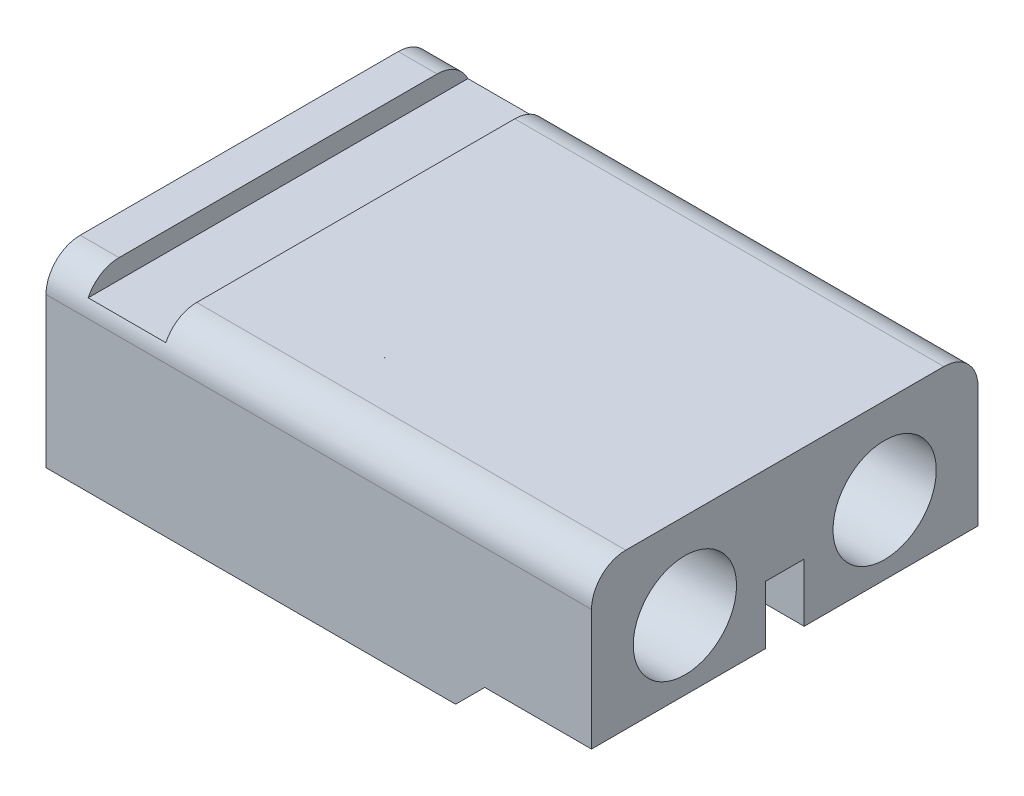
ISO-10303-21;
HEADER;
FILE_DESCRIPTION(('STEP AP214'),'2;1');
FILE_NAME('part.step','',(''),(''),'','','');
FILE_SCHEMA(('AUTOMOTIVE_DESIGN { 1 0 10303 214 1 1 1 1 }'));
ENDSEC;
DATA;
#1=APPLICATION_CONTEXT('core data for automotive mechanical design processes');
#2=APPLICATION_PROTOCOL_DEFINITION('international standard','automotive_design',2000,#1);
#3=PRODUCT_CONTEXT('',#1,'mechanical');
#4=PRODUCT('Part','Part','',(#3));
#5=PRODUCT_RELATED_PRODUCT_CATEGORY('part','',(#4));
#6=PRODUCT_DEFINITION_FORMATION('','',#4);
#7=PRODUCT_DEFINITION_CONTEXT('part definition',#1,'design');
#8=PRODUCT_DEFINITION('design','',#6,#7);
#9=PRODUCT_DEFINITION_SHAPE('','',#8);
#10=(LENGTH_UNIT() NAMED_UNIT(*) SI_UNIT(.MILLI.,.METRE.));
#11=(NAMED_UNIT(*) PLANE_ANGLE_UNIT() SI_UNIT($,.RADIAN.));
#12=(NAMED_UNIT(*) SI_UNIT($,.STERADIAN.) SOLID_ANGLE_UNIT());
#13=UNCERTAINTY_MEASURE_WITH_UNIT(LENGTH_MEASURE(1.E-05),#10,'distance_accuracy_value','');
#14=(GEOMETRIC_REPRESENTATION_CONTEXT(3) GLOBAL_UNCERTAINTY_ASSIGNED_CONTEXT((#13)) GLOBAL_UNIT_ASSIGNED_CONTEXT((#10,
#11,#12)) REPRESENTATION_CONTEXT('',''));
#15=CARTESIAN_POINT('',(0.,0.,0.));
#16=DIRECTION('',(0.,0.,1.));
#17=DIRECTION('',(1.,0.,0.));
#18=AXIS2_PLACEMENT_3D('',#15,#16,#17);
#19=CARTESIAN_POINT('',(115.35,67.1589677549836,25.4));
#20=DIRECTION('',(0.,-1.,0.));
#21=DIRECTION('',(0.,0.,-1.));
#22=AXIS2_PLACEMENT_3D('',#19,#20,#21);
#23=PLANE('',#22);
#24=DIRECTION('',(-1.,0.,0.));
#25=VECTOR('',#24,1.);
#26=CARTESIAN_POINT('',(115.35,67.1589677549836,-8.19149999999992));
#27=LINE('',#26,#25);
#28=CARTESIAN_POINT('',(115.35,67.1589677549836,-8.19149999999992));
#29=VERTEX_POINT('',#28);
#30=CARTESIAN_POINT('',(93.2499999989931,67.1589677549836,-8.19149999999993));
#31=VERTEX_POINT('',#30);
#32=EDGE_CURVE('E323',#29,#31,#27,.T.);
#33=ORIENTED_EDGE('',*,*,#32,.T.);
#34=DIRECTION('',(0.,0.,-1.));
#35=VECTOR('',#34,1.);
#36=CARTESIAN_POINT('',(93.2499999989931,67.1589677549836,25.4));
#37=LINE('',#36,#35);
#38=CARTESIAN_POINT('',(93.2499999989931,67.1589677549836,8.19150000000008));
#39=VERTEX_POINT('',#38);
#40=EDGE_CURVE('E211',#39,#31,#37,.T.);
#41=ORIENTED_EDGE('',*,*,#40,.F.);
#42=DIRECTION('',(-1.,0.,0.));
#43=VECTOR('',#42,1.);
#44=CARTESIAN_POINT('',(115.35,67.1589677549836,8.19150000000007));
#45=LINE('',#44,#43);
#46=CARTESIAN_POINT('',(115.35,67.1589677549836,8.19150000000007));
#47=VERTEX_POINT('',#46);
#48=EDGE_CURVE('E328',#47,#39,#45,.T.);
#49=ORIENTED_EDGE('',*,*,#48,.F.);
#50=DIRECTION('',(0.,0.,1.));
#51=VECTOR('',#50,1.);
#52=CARTESIAN_POINT('',(115.35,67.1589677549836,25.4));
#53=LINE('',#52,#51);
#54=EDGE_CURVE('E318',#29,#47,#53,.T.);
#55=ORIENTED_EDGE('',*,*,#54,.F.);
#56=EDGE_LOOP('',(#33,#41,#49,#55));
#57=FACE_BOUND('',#56,.T.);
#58=ADVANCED_FACE('F35',(#57),#23,.F.);
#59=CARTESIAN_POINT('',(115.35,-4.000000001,9.95350000000009));
#60=DIRECTION('',(0.,0.,-1.));
#61=DIRECTION('',(0.,1.,0.));
#62=AXIS2_PLACEMENT_3D('',#59,#60,#61);
#63=PLANE('',#62);
#64=DIRECTION('',(0.707106781186546,0.707106781186549,0.));
#65=VECTOR('',#64,1.);
#66=CARTESIAN_POINT('',(108.35,57.6659677549836,9.95350000000008));
#67=LINE('',#66,#65);
#68=CARTESIAN_POINT('',(108.35,57.6659677549836,9.95350000000008));
#69=VERTEX_POINT('',#68);
#70=CARTESIAN_POINT('',(109.85,59.1659677549836,9.95350000000008));
#71=VERTEX_POINT('',#70);
#72=EDGE_CURVE('E355',#69,#71,#67,.T.);
#73=ORIENTED_EDGE('',*,*,#72,.T.);
#74=DIRECTION('',(1.,0.,0.));
#75=VECTOR('',#74,1.);
#76=CARTESIAN_POINT('',(111.35,59.1659677549836,9.95350000000008));
#77=LINE('',#76,#75);
#78=CARTESIAN_POINT('',(115.35,59.1659677549836,9.95350000000008));
#79=VERTEX_POINT('',#78);
#80=EDGE_CURVE('E217',#71,#79,#77,.T.);
#81=ORIENTED_EDGE('',*,*,#80,.T.);
#82=DIRECTION('',(0.,-1.,0.));
#83=VECTOR('',#82,1.);
#84=CARTESIAN_POINT('',(115.35,-4.000000001,9.95350000000009));
#85=LINE('',#84,#83);
#86=CARTESIAN_POINT('',(115.35,65.3969677549836,9.95350000000008));
#87=VERTEX_POINT('',#86);
#88=EDGE_CURVE('E312',#87,#79,#85,.T.);
#89=ORIENTED_EDGE('',*,*,#88,.F.);
#90=DIRECTION('',(-1.,0.,0.));
#91=VECTOR('',#90,1.);
#92=CARTESIAN_POINT('',(115.35,65.3969677549836,9.95350000000008));
#93=LINE('',#92,#91);
#94=CARTESIAN_POINT('',(87.249999998,65.3969677549836,9.95350000000008));
#95=VERTEX_POINT('',#94);
#96=EDGE_CURVE('E331',#87,#95,#93,.T.);
#97=ORIENTED_EDGE('',*,*,#96,.T.);
#98=DIRECTION('',(0.,1.,0.));
#99=VECTOR('',#98,1.);
#100=CARTESIAN_POINT('',(87.249999998,57.6659677549836,9.95350000000008));
#101=LINE('',#100,#99);
#102=CARTESIAN_POINT('',(87.249999998,57.6659677549836,9.95350000000008));
#103=VERTEX_POINT('',#102);
#104=EDGE_CURVE('E289',#103,#95,#101,.T.);
#105=ORIENTED_EDGE('',*,*,#104,.F.);
#106=DIRECTION('',(-1.,0.,0.));
#107=VECTOR('',#106,1.);
#108=CARTESIAN_POINT('',(115.35,57.6659677549836,9.95350000000008));
#109=LINE('',#108,#107);
#110=EDGE_CURVE('E333',#69,#103,#109,.T.);
#111=ORIENTED_EDGE('',*,*,#110,.F.);
#112=EDGE_LOOP('',(#73,#81,#89,#97,#105,#111));
#113=FACE_BOUND('',#112,.T.);
#114=ADVANCED_FACE('F389',(#113),#63,.F.);
#115=CARTESIAN_POINT('',(115.35,57.6659677549836,25.4));
#116=DIRECTION('',(0.,1.,0.));
#117=DIRECTION('',(0.,0.,1.));
#118=AXIS2_PLACEMENT_3D('',#115,#116,#117);
#119=PLANE('',#118);
#120=DIRECTION('',(-1.,0.,0.));
#121=VECTOR('',#120,1.);
#122=CARTESIAN_POINT('',(115.35,57.6659677549836,-9.95349999999993));
#123=LINE('',#122,#121);
#124=CARTESIAN_POINT('',(108.35,57.6659677549836,-9.95349999999993));
#125=VERTEX_POINT('',#124);
#126=CARTESIAN_POINT('',(87.249999998,57.6659677549836,-9.95349999999993));
#127=VERTEX_POINT('',#126);
#128=EDGE_CURVE('E335',#125,#127,#123,.T.);
#129=ORIENTED_EDGE('',*,*,#128,.F.);
#130=DIRECTION('',(0.,0.,1.));
#131=VECTOR('',#130,1.);
#132=CARTESIAN_POINT('',(108.35,57.6659677549836,9.95350000000008));
#133=LINE('',#132,#131);
#134=EDGE_CURVE('E348',#125,#69,#133,.T.);
#135=ORIENTED_EDGE('',*,*,#134,.T.);
#136=ORIENTED_EDGE('',*,*,#110,.T.);
#137=DIRECTION('',(0.,0.,1.));
#138=VECTOR('',#137,1.);
#139=CARTESIAN_POINT('',(87.249999998,57.6659677549836,5.95958480058196));
#140=LINE('',#139,#138);
#141=CARTESIAN_POINT('',(87.249999998,57.6659677549836,5.95958480058196));
#142=VERTEX_POINT('',#141);
#143=EDGE_CURVE('E292',#142,#103,#140,.T.);
#144=ORIENTED_EDGE('',*,*,#143,.F.);
#145=DIRECTION('',(1.,0.,0.));
#146=VECTOR('',#145,1.);
#147=CARTESIAN_POINT('',(65.1953928149192,57.6659677549836,5.95958480058196));
#148=LINE('',#147,#146);
#149=CARTESIAN_POINT('',(88.4709999689999,57.6659677549836,5.95958480058196));
#150=VERTEX_POINT('',#149);
#151=EDGE_CURVE('E301',#142,#150,#148,.T.);
#152=ORIENTED_EDGE('',*,*,#151,.T.);
#153=DIRECTION('',(0.,0.,-1.));
#154=VECTOR('',#153,1.);
#155=CARTESIAN_POINT('',(88.4709999689967,57.6659677549836,25.3999999999975));
#156=LINE('',#155,#154);
#157=CARTESIAN_POINT('',(88.4709999689984,57.6659677549836,6.81226125144575));
#158=VERTEX_POINT('',#157);
#159=EDGE_CURVE('E266',#158,#150,#156,.T.);
#160=ORIENTED_EDGE('',*,*,#159,.F.);
#161=DIRECTION('',(1.,0.,0.));
#162=VECTOR('',#161,1.);
#163=CARTESIAN_POINT('',(57.042554354252,57.6659677549836,6.81226125144575));
#164=LINE('',#163,#162);
#165=CARTESIAN_POINT('',(94.0290000289984,57.6659677549836,6.81226125144575));
#166=VERTEX_POINT('',#165);
#167=EDGE_CURVE('E345',#158,#166,#164,.T.);
#168=ORIENTED_EDGE('',*,*,#167,.T.);
#169=DIRECTION('',(0.,0.,-1.));
#170=VECTOR('',#169,1.);
#171=CARTESIAN_POINT('',(94.0290000289967,57.6659677549836,25.399999999998));
#172=LINE('',#171,#170);
#173=CARTESIAN_POINT('',(94.0290000289985,57.6659677549836,5.95958480058196));
#174=VERTEX_POINT('',#173);
#175=EDGE_CURVE('E270',#166,#174,#172,.T.);
#176=ORIENTED_EDGE('',*,*,#175,.T.);
#177=CARTESIAN_POINT('',(95.25,57.6659677549836,5.95958480058196));
#178=VERTEX_POINT('',#177);
#179=EDGE_CURVE('E274',#174,#178,#148,.T.);
#180=ORIENTED_EDGE('',*,*,#179,.T.);
#181=DIRECTION('',(0.,0.,-1.));
#182=VECTOR('',#181,1.);
#183=CARTESIAN_POINT('',(95.25,57.6659677549836,25.4));
#184=LINE('',#183,#182);
#185=CARTESIAN_POINT('',(95.25,57.6659677549836,-5.96241865359733));
#186=VERTEX_POINT('',#185);
#187=EDGE_CURVE('E279',#178,#186,#184,.T.);
#188=ORIENTED_EDGE('',*,*,#187,.T.);
#189=DIRECTION('',(1.,0.,0.));
#190=VECTOR('',#189,1.);
#191=CARTESIAN_POINT('',(65.1953928149192,57.6659677549836,-5.96241865359733));
#192=LINE('',#191,#190);
#193=CARTESIAN_POINT('',(94.0290000289996,57.6659677549836,-5.96241865359733));
#194=VERTEX_POINT('',#193);
#195=EDGE_CURVE('E306',#194,#186,#192,.T.);
#196=ORIENTED_EDGE('',*,*,#195,.F.);
#197=CARTESIAN_POINT('',(94.0290000289997,57.6659677549836,-6.81226125144575));
#198=VERTEX_POINT('',#197);
#199=EDGE_CURVE('E267',#194,#198,#172,.T.);
#200=ORIENTED_EDGE('',*,*,#199,.T.);
#201=DIRECTION('',(1.,0.,0.));
#202=VECTOR('',#201,1.);
#203=CARTESIAN_POINT('',(57.042554354252,57.6659677549836,-6.81226125144575));
#204=LINE('',#203,#202);
#205=CARTESIAN_POINT('',(88.4709999689996,57.6659677549836,-6.81226125144575));
#206=VERTEX_POINT('',#205);
#207=EDGE_CURVE('E342',#198,#206,#204,.F.);
#208=ORIENTED_EDGE('',*,*,#207,.T.);
#209=CARTESIAN_POINT('',(88.4709999689996,57.6659677549836,-5.96241865359733));
#210=VERTEX_POINT('',#209);
#211=EDGE_CURVE('E264',#210,#206,#156,.T.);
#212=ORIENTED_EDGE('',*,*,#211,.F.);
#213=CARTESIAN_POINT('',(87.249999998,57.6659677549836,-5.96241865359733));
#214=VERTEX_POINT('',#213);
#215=EDGE_CURVE('E275',#214,#210,#192,.T.);
#216=ORIENTED_EDGE('',*,*,#215,.F.);
#217=DIRECTION('',(0.,0.,1.));
#218=VECTOR('',#217,1.);
#219=CARTESIAN_POINT('',(87.249999998,57.6659677549836,-9.95349999999993));
#220=LINE('',#219,#218);
#221=EDGE_CURVE('E298',#127,#214,#220,.T.);
#222=ORIENTED_EDGE('',*,*,#221,.F.);
#223=EDGE_LOOP('',(#129,#135,#136,#144,#152,#160,#168,#176,#180,#188,#196,#200,#208,#212,#216,#222));
#224=FACE_BOUND('',#223,.T.);
#225=ADVANCED_FACE('F417',(#224),#119,.F.);
#226=CARTESIAN_POINT('',(115.35,-4.000000001,-9.95349999999993));
#227=DIRECTION('',(0.,0.,1.));
#228=DIRECTION('',(1.,0.,0.));
#229=AXIS2_PLACEMENT_3D('',#226,#227,#228);
#230=PLANE('',#229);
#231=DIRECTION('',(1.,0.,0.));
#232=VECTOR('',#231,1.);
#233=CARTESIAN_POINT('',(111.35,59.1659677549836,-9.95350000000008));
#234=LINE('',#233,#232);
#235=CARTESIAN_POINT('',(109.85,59.1659677549836,-9.95349999999993));
#236=VERTEX_POINT('',#235);
#237=CARTESIAN_POINT('',(115.35,59.1659677549836,-9.95350000000008));
#238=VERTEX_POINT('',#237);
#239=EDGE_CURVE('E220',#236,#238,#234,.T.);
#240=ORIENTED_EDGE('',*,*,#239,.F.);
#241=DIRECTION('',(-0.707106781186546,-0.707106781186549,0.));
#242=VECTOR('',#241,1.);
#243=CARTESIAN_POINT('',(108.35,57.6659677549836,-9.95349999999993));
#244=LINE('',#243,#242);
#245=EDGE_CURVE('E360',#236,#125,#244,.T.);
#246=ORIENTED_EDGE('',*,*,#245,.T.);
#247=ORIENTED_EDGE('',*,*,#128,.T.);
#248=DIRECTION('',(0.,-1.,0.));
#249=VECTOR('',#248,1.);
#250=CARTESIAN_POINT('',(87.249999998,65.3969677549836,-9.95349999999993));
#251=LINE('',#250,#249);
#252=CARTESIAN_POINT('',(87.249999998,65.3969677549836,-9.95349999999992));
#253=VERTEX_POINT('',#252);
#254=EDGE_CURVE('E276',#253,#127,#251,.T.);
#255=ORIENTED_EDGE('',*,*,#254,.F.);
#256=DIRECTION('',(-1.,0.,0.));
#257=VECTOR('',#256,1.);
#258=CARTESIAN_POINT('',(115.35,65.3969677549836,-9.95349999999993));
#259=LINE('',#258,#257);
#260=CARTESIAN_POINT('',(115.35,65.3969677549836,-9.95349999999993));
#261=VERTEX_POINT('',#260);
#262=EDGE_CURVE('E320',#261,#253,#259,.T.);
#263=ORIENTED_EDGE('',*,*,#262,.F.);
#264=DIRECTION('',(0.,1.,0.));
#265=VECTOR('',#264,1.);
#266=CARTESIAN_POINT('',(115.35,-4.000000001,-9.95349999999993));
#267=LINE('',#266,#265);
#268=EDGE_CURVE('E310',#238,#261,#267,.T.);
#269=ORIENTED_EDGE('',*,*,#268,.F.);
#270=EDGE_LOOP('',(#240,#246,#247,#255,#263,#269));
#271=FACE_BOUND('',#270,.T.);
#272=ADVANCED_FACE('F439',(#271),#230,.F.);
#273=CARTESIAN_POINT('',(115.35,65.3969677549836,-8.19149999999992));
#274=DIRECTION('',(-1.,0.,0.));
#275=DIRECTION('',(0.,0.,1.));
#276=AXIS2_PLACEMENT_3D('',#273,#274,#275);
#277=PLANE('',#276);
#278=CARTESIAN_POINT('',(115.35,62.7299677549836,5.14350000000008));
#279=DIRECTION('',(1.,0.,0.));
#280=DIRECTION('',(0.,0.,-1.));
#281=AXIS2_PLACEMENT_3D('',#278,#279,#280);
#282=CIRCLE('',#281,2.659);
#283=CARTESIAN_POINT('',(115.35,62.7299677549836,2.48450000000008));
#284=VERTEX_POINT('',#283);
#285=EDGE_CURVE('E254',#284,#284,#282,.T.);
#286=ORIENTED_EDGE('',*,*,#285,.F.);
#287=EDGE_LOOP('',(#286));
#288=FACE_BOUND('',#287,.T.);
#289=CARTESIAN_POINT('',(115.35,62.7299677549836,-5.14349999999994));
#290=DIRECTION('',(1.,0.,0.));
#291=DIRECTION('',(0.,0.,-1.));
#292=AXIS2_PLACEMENT_3D('',#289,#290,#291);
#293=CIRCLE('',#292,2.659);
#294=CARTESIAN_POINT('',(115.35,62.7299677549836,-7.80249999999994));
#295=VERTEX_POINT('',#294);
#296=EDGE_CURVE('E250',#295,#295,#293,.T.);
#297=ORIENTED_EDGE('',*,*,#296,.F.);
#298=EDGE_LOOP('',(#297));
#299=FACE_BOUND('',#298,.T.);
#300=DIRECTION('',(0.,0.,-1.));
#301=VECTOR('',#300,1.);
#302=CARTESIAN_POINT('',(115.35,59.1659677549836,9.95350000000008));
#303=LINE('',#302,#301);
#304=CARTESIAN_POINT('',(115.35,59.1659677549836,-1.));
#305=VERTEX_POINT('',#304);
#306=EDGE_CURVE('E226',#305,#238,#303,.T.);
#307=ORIENTED_EDGE('',*,*,#306,.T.);
#308=ORIENTED_EDGE('',*,*,#268,.T.);
#309=CARTESIAN_POINT('',(115.35,65.3969677549836,-8.19149999999992));
#310=DIRECTION('',(-1.,0.,0.));
#311=DIRECTION('',(0.,0.,1.));
#312=AXIS2_PLACEMENT_3D('',#309,#310,#311);
#313=CIRCLE('',#312,1.762);
#314=EDGE_CURVE('E307',#29,#261,#313,.T.);
#315=ORIENTED_EDGE('',*,*,#314,.F.);
#316=ORIENTED_EDGE('',*,*,#54,.T.);
#317=CARTESIAN_POINT('',(115.35,65.3969677549836,8.19150000000008));
#318=DIRECTION('',(-1.,0.,0.));
#319=DIRECTION('',(0.,0.,1.));
#320=AXIS2_PLACEMENT_3D('',#317,#318,#319);
#321=CIRCLE('',#320,1.762);
#322=EDGE_CURVE('E315',#87,#47,#321,.T.);
#323=ORIENTED_EDGE('',*,*,#322,.F.);
#324=ORIENTED_EDGE('',*,*,#88,.T.);
#325=CARTESIAN_POINT('',(115.35,59.1659677549836,1.));
#326=VERTEX_POINT('',#325);
#327=EDGE_CURVE('E223',#79,#326,#303,.T.);
#328=ORIENTED_EDGE('',*,*,#327,.T.);
#329=DIRECTION('',(0.,1.,0.));
#330=VECTOR('',#329,1.);
#331=CARTESIAN_POINT('',(115.35,0.,1.));
#332=LINE('',#331,#330);
#333=CARTESIAN_POINT('',(115.35,62.1659677549836,1.));
#334=VERTEX_POINT('',#333);
#335=EDGE_CURVE('E236',#326,#334,#332,.T.);
#336=ORIENTED_EDGE('',*,*,#335,.T.);
#337=DIRECTION('',(0.,0.,-1.));
#338=VECTOR('',#337,1.);
#339=CARTESIAN_POINT('',(115.35,62.1659677549836,0.));
#340=LINE('',#339,#338);
#341=CARTESIAN_POINT('',(115.35,62.1659677549836,-0.999999999999999));
#342=VERTEX_POINT('',#341);
#343=EDGE_CURVE('E239',#334,#342,#340,.T.);
#344=ORIENTED_EDGE('',*,*,#343,.T.);
#345=DIRECTION('',(0.,-1.,0.));
#346=VECTOR('',#345,1.);
#347=CARTESIAN_POINT('',(115.35,0.,-1.00000000000002));
#348=LINE('',#347,#346);
#349=EDGE_CURVE('E221',#342,#305,#348,.T.);
#350=ORIENTED_EDGE('',*,*,#349,.T.);
#351=EDGE_LOOP('',(#307,#308,#315,#316,#323,#324,#328,#336,#344,#350));
#352=FACE_BOUND('',#351,.T.);
#353=ADVANCED_FACE('F392',(#288,#299,#352),#277,.F.);
#354=CARTESIAN_POINT('',(65.1953928149192,48.8874973835213,-0.00141692650768369));
#355=DIRECTION('',(1.,0.,0.));
#356=DIRECTION('',(0.,0.,-1.));
#357=AXIS2_PLACEMENT_3D('',#354,#355,#356);
#358=CYLINDRICAL_SURFACE('',#357,10.6110830574926);
#359=CARTESIAN_POINT('',(88.470999968999,48.8874973835213,-0.00141692650768369));
#360=DIRECTION('',(1.,0.,0.));
#361=DIRECTION('',(0.,0.,-1.));
#362=AXIS2_PLACEMENT_3D('',#359,#360,#361);
#363=CIRCLE('',#362,10.6110830574926);
#364=EDGE_CURVE('E326',#150,#210,#363,.F.);
#365=ORIENTED_EDGE('',*,*,#364,.F.);
#366=ORIENTED_EDGE('',*,*,#151,.F.);
#367=CARTESIAN_POINT('',(87.249999998,48.8874973835213,-0.00141692650768369));
#368=DIRECTION('',(-1.,0.,0.));
#369=DIRECTION('',(0.,0.,1.));
#370=AXIS2_PLACEMENT_3D('',#367,#368,#369);
#371=CIRCLE('',#370,10.6110830574926);
#372=EDGE_CURVE('E295',#214,#142,#371,.F.);
#373=ORIENTED_EDGE('',*,*,#372,.F.);
#374=ORIENTED_EDGE('',*,*,#215,.T.);
#375=EDGE_LOOP('',(#365,#366,#373,#374));
#376=FACE_BOUND('',#375,.T.);
#377=ADVANCED_FACE('F427',(#376),#358,.F.);
#378=CARTESIAN_POINT('',(95.25,65.3969677549836,-8.19149999999992));
#379=DIRECTION('',(-1.,0.,0.));
#380=DIRECTION('',(0.,0.,1.));
#381=AXIS2_PLACEMENT_3D('',#378,#379,#380);
#382=PLANE('',#381);
#383=CARTESIAN_POINT('',(95.25,48.8874973835213,-0.00141692650768369));
#384=DIRECTION('',(1.,0.,0.));
#385=DIRECTION('',(0.,0.,1.));
#386=AXIS2_PLACEMENT_3D('',#383,#384,#385);
#387=CIRCLE('',#386,10.6110830574926);
#388=EDGE_CURVE('E271',#186,#178,#387,.T.);
#389=ORIENTED_EDGE('',*,*,#388,.F.);
#390=ORIENTED_EDGE('',*,*,#187,.F.);
#391=EDGE_LOOP('',(#389,#390));
#392=FACE_BOUND('',#391,.T.);
#393=ADVANCED_FACE('F422',(#392),#382,.T.);
#394=CARTESIAN_POINT('',(89.2499999989931,67.1589677549836,8.19150000000008));
#395=VERTEX_POINT('',#394);
#396=CARTESIAN_POINT('',(87.249999998,67.1589677549836,8.19150000000007));
#397=VERTEX_POINT('',#396);
#398=EDGE_CURVE('E330',#395,#397,#45,.T.);
#399=ORIENTED_EDGE('',*,*,#398,.F.);
#400=DIRECTION('',(0.,0.,-1.));
#401=VECTOR('',#400,1.);
#402=CARTESIAN_POINT('',(89.2499999989931,67.1589677549836,25.4));
#403=LINE('',#402,#401);
#404=CARTESIAN_POINT('',(89.2499999989931,67.1589677549836,-8.19149999999992));
#405=VERTEX_POINT('',#404);
#406=EDGE_CURVE('E197',#395,#405,#403,.T.);
#407=ORIENTED_EDGE('',*,*,#406,.T.);
#408=CARTESIAN_POINT('',(87.249999998,67.1589677549836,-8.19149999999992));
#409=VERTEX_POINT('',#408);
#410=EDGE_CURVE('E327',#405,#409,#27,.T.);
#411=ORIENTED_EDGE('',*,*,#410,.T.);
#412=DIRECTION('',(0.,0.,-1.));
#413=VECTOR('',#412,1.);
#414=CARTESIAN_POINT('',(87.249999998,67.1589677549836,8.19150000000007));
#415=LINE('',#414,#413);
#416=EDGE_CURVE('E283',#397,#409,#415,.T.);
#417=ORIENTED_EDGE('',*,*,#416,.F.);
#418=EDGE_LOOP('',(#399,#407,#411,#417));
#419=FACE_BOUND('',#418,.T.);
#420=ADVANCED_FACE('F374',(#419),#23,.F.);
#421=CARTESIAN_POINT('',(115.35,65.3969677549836,8.19150000000008));
#422=DIRECTION('',(-1.,0.,0.));
#423=DIRECTION('',(0.,0.,1.));
#424=AXIS2_PLACEMENT_3D('',#421,#422,#423);
#425=CYLINDRICAL_SURFACE('',#424,1.762);
#426=CARTESIAN_POINT('',(93.2499999989931,65.3969677549836,8.19150000000008));
#427=DIRECTION('',(1.,0.,0.));
#428=DIRECTION('',(0.,0.,-1.));
#429=AXIS2_PLACEMENT_3D('',#426,#427,#428);
#430=CIRCLE('',#429,1.762);
#431=CARTESIAN_POINT('',(93.2499999989931,66.1589677549836,9.78021016865892));
#432=VERTEX_POINT('',#431);
#433=EDGE_CURVE('E201',#432,#39,#430,.F.);
#434=ORIENTED_EDGE('',*,*,#433,.F.);
#435=DIRECTION('',(-1.,0.,0.));
#436=VECTOR('',#435,1.);
#437=CARTESIAN_POINT('',(115.35,66.1589677549836,9.78021016865892));
#438=LINE('',#437,#436);
#439=CARTESIAN_POINT('',(89.2499999989931,66.1589677549836,9.78021016865892));
#440=VERTEX_POINT('',#439);
#441=EDGE_CURVE('E202',#440,#432,#438,.F.);
#442=ORIENTED_EDGE('',*,*,#441,.F.);
#443=CARTESIAN_POINT('',(89.2499999989931,65.3969677549836,8.19150000000008));
#444=DIRECTION('',(-1.,0.,0.));
#445=DIRECTION('',(0.,0.,1.));
#446=AXIS2_PLACEMENT_3D('',#443,#444,#445);
#447=CIRCLE('',#446,1.762);
#448=EDGE_CURVE('E191',#395,#440,#447,.F.);
#449=ORIENTED_EDGE('',*,*,#448,.F.);
#450=ORIENTED_EDGE('',*,*,#398,.T.);
#451=CARTESIAN_POINT('',(87.249999998,65.3969677549836,8.19150000000008));
#452=DIRECTION('',(-1.,0.,0.));
#453=DIRECTION('',(0.,0.,1.));
#454=AXIS2_PLACEMENT_3D('',#451,#452,#453);
#455=CIRCLE('',#454,1.762);
#456=EDGE_CURVE('E286',#95,#397,#455,.T.);
#457=ORIENTED_EDGE('',*,*,#456,.F.);
#458=ORIENTED_EDGE('',*,*,#96,.F.);
#459=ORIENTED_EDGE('',*,*,#322,.T.);
#460=ORIENTED_EDGE('',*,*,#48,.T.);
#461=EDGE_LOOP('',(#434,#442,#449,#450,#457,#458,#459,#460));
#462=FACE_BOUND('',#461,.T.);
#463=ADVANCED_FACE('F209',(#462),#425,.T.);
#464=CARTESIAN_POINT('',(115.35,65.3969677549836,-8.19149999999992));
#465=DIRECTION('',(-1.,0.,0.));
#466=DIRECTION('',(0.,0.,1.));
#467=AXIS2_PLACEMENT_3D('',#464,#465,#466);
#468=CYLINDRICAL_SURFACE('',#467,1.762);
#469=CARTESIAN_POINT('',(93.2499999989931,65.3969677549836,-8.19149999999992));
#470=DIRECTION('',(1.,0.,0.));
#471=DIRECTION('',(0.,0.,-1.));
#472=AXIS2_PLACEMENT_3D('',#469,#470,#471);
#473=CIRCLE('',#472,1.762);
#474=CARTESIAN_POINT('',(93.2499999989931,66.1589677549836,-9.78021016865877));
#475=VERTEX_POINT('',#474);
#476=EDGE_CURVE('E11',#31,#475,#473,.F.);
#477=ORIENTED_EDGE('',*,*,#476,.F.);
#478=ORIENTED_EDGE('',*,*,#32,.F.);
#479=ORIENTED_EDGE('',*,*,#314,.T.);
#480=ORIENTED_EDGE('',*,*,#262,.T.);
#481=CARTESIAN_POINT('',(87.249999998,65.3969677549836,-8.19149999999992));
#482=DIRECTION('',(-1.,0.,0.));
#483=DIRECTION('',(0.,0.,1.));
#484=AXIS2_PLACEMENT_3D('',#481,#482,#483);
#485=CIRCLE('',#484,1.762);
#486=EDGE_CURVE('E280',#409,#253,#485,.T.);
#487=ORIENTED_EDGE('',*,*,#486,.F.);
#488=ORIENTED_EDGE('',*,*,#410,.F.);
#489=CARTESIAN_POINT('',(89.2499999989931,65.3969677549836,-8.19149999999992));
#490=DIRECTION('',(-1.,0.,0.));
#491=DIRECTION('',(0.,0.,1.));
#492=AXIS2_PLACEMENT_3D('',#489,#490,#491);
#493=CIRCLE('',#492,1.762);
#494=CARTESIAN_POINT('',(89.2499999989931,66.1589677549836,-9.78021016865877));
#495=VERTEX_POINT('',#494);
#496=EDGE_CURVE('E44',#495,#405,#493,.F.);
#497=ORIENTED_EDGE('',*,*,#496,.F.);
#498=DIRECTION('',(-1.,0.,0.));
#499=VECTOR('',#498,1.);
#500=CARTESIAN_POINT('',(115.35,66.1589677549836,-9.78021016865877));
#501=LINE('',#500,#499);
#502=EDGE_CURVE('E206',#475,#495,#501,.T.);
#503=ORIENTED_EDGE('',*,*,#502,.F.);
#504=EDGE_LOOP('',(#477,#478,#479,#480,#487,#488,#497,#503));
#505=FACE_BOUND('',#504,.T.);
#506=ADVANCED_FACE('F379',(#505),#468,.T.);
#507=ORIENTED_EDGE('',*,*,#179,.F.);
#508=CARTESIAN_POINT('',(94.029000028999,48.8874973835213,-0.00141692650768369));
#509=DIRECTION('',(1.,0.,0.));
#510=DIRECTION('',(0.,0.,-1.));
#511=AXIS2_PLACEMENT_3D('',#508,#509,#510);
#512=CIRCLE('',#511,10.6110830574926);
#513=EDGE_CURVE('E339',#174,#194,#512,.F.);
#514=ORIENTED_EDGE('',*,*,#513,.T.);
#515=ORIENTED_EDGE('',*,*,#195,.T.);
#516=ORIENTED_EDGE('',*,*,#388,.T.);
#517=EDGE_LOOP('',(#507,#514,#515,#516));
#518=FACE_BOUND('',#517,.T.);
#519=ADVANCED_FACE('F434',(#518),#358,.F.);
#520=CARTESIAN_POINT('',(87.249999998,4.000000001,25.4));
#521=DIRECTION('',(-1.,0.,0.));
#522=DIRECTION('',(0.,0.,1.));
#523=AXIS2_PLACEMENT_3D('',#520,#521,#522);
#524=PLANE('',#523);
#525=CARTESIAN_POINT('',(87.249999998,62.7299677549836,-5.14349999999994));
#526=DIRECTION('',(-1.,0.,0.));
#527=DIRECTION('',(0.,0.,1.));
#528=AXIS2_PLACEMENT_3D('',#525,#526,#527);
#529=CIRCLE('',#528,2.659);
#530=CARTESIAN_POINT('',(87.249999998,62.7299677549836,-2.48449999999993));
#531=VERTEX_POINT('',#530);
#532=EDGE_CURVE('E261',#531,#531,#529,.F.);
#533=ORIENTED_EDGE('',*,*,#532,.T.);
#534=EDGE_LOOP('',(#533));
#535=FACE_BOUND('',#534,.T.);
#536=CARTESIAN_POINT('',(87.249999998,62.7299677549836,5.14350000000008));
#537=DIRECTION('',(-1.,0.,0.));
#538=DIRECTION('',(0.,0.,1.));
#539=AXIS2_PLACEMENT_3D('',#536,#537,#538);
#540=CIRCLE('',#539,2.659);
#541=CARTESIAN_POINT('',(87.249999998,62.7299677549836,7.80250000000008));
#542=VERTEX_POINT('',#541);
#543=EDGE_CURVE('E253',#542,#542,#540,.F.);
#544=ORIENTED_EDGE('',*,*,#543,.T.);
#545=EDGE_LOOP('',(#544));
#546=FACE_BOUND('',#545,.T.);
#547=ORIENTED_EDGE('',*,*,#221,.T.);
#548=ORIENTED_EDGE('',*,*,#372,.T.);
#549=ORIENTED_EDGE('',*,*,#143,.T.);
#550=ORIENTED_EDGE('',*,*,#104,.T.);
#551=ORIENTED_EDGE('',*,*,#456,.T.);
#552=ORIENTED_EDGE('',*,*,#416,.T.);
#553=ORIENTED_EDGE('',*,*,#486,.T.);
#554=ORIENTED_EDGE('',*,*,#254,.T.);
#555=EDGE_LOOP('',(#547,#548,#549,#550,#551,#552,#553,#554));
#556=FACE_BOUND('',#555,.T.);
#557=ADVANCED_FACE('F383',(#535,#546,#556),#524,.T.);
#558=CARTESIAN_POINT('',(57.042554354252,48.887500015,0.));
#559=DIRECTION('',(1.,0.,0.));
#560=DIRECTION('',(0.,0.,-1.));
#561=AXIS2_PLACEMENT_3D('',#558,#559,#560);
#562=CYLINDRICAL_SURFACE('',#561,11.1116335081698);
#563=CARTESIAN_POINT('',(88.470999968999,48.887500015,0.));
#564=DIRECTION('',(1.,0.,0.));
#565=DIRECTION('',(0.,0.,-1.));
#566=AXIS2_PLACEMENT_3D('',#563,#564,#565);
#567=CIRCLE('',#566,11.1116335081698);
#568=EDGE_CURVE('E260',#158,#206,#567,.F.);
#569=ORIENTED_EDGE('',*,*,#568,.T.);
#570=ORIENTED_EDGE('',*,*,#207,.F.);
#571=CARTESIAN_POINT('',(94.029000028999,48.887500015,0.));
#572=DIRECTION('',(1.,0.,0.));
#573=DIRECTION('',(0.,0.,-1.));
#574=AXIS2_PLACEMENT_3D('',#571,#572,#573);
#575=CIRCLE('',#574,11.1116335081698);
#576=EDGE_CURVE('E257',#198,#166,#575,.T.);
#577=ORIENTED_EDGE('',*,*,#576,.T.);
#578=ORIENTED_EDGE('',*,*,#167,.F.);
#579=EDGE_LOOP('',(#569,#570,#577,#578));
#580=FACE_BOUND('',#579,.T.);
#581=ADVANCED_FACE('F442',(#580),#562,.F.);
#582=CARTESIAN_POINT('',(94.029000028999,48.887500015,0.));
#583=DIRECTION('',(1.,0.,0.));
#584=DIRECTION('',(0.,0.,-1.));
#585=AXIS2_PLACEMENT_3D('',#582,#583,#584);
#586=PLANE('',#585);
#587=ORIENTED_EDGE('',*,*,#576,.F.);
#588=ORIENTED_EDGE('',*,*,#199,.F.);
#589=ORIENTED_EDGE('',*,*,#513,.F.);
#590=ORIENTED_EDGE('',*,*,#175,.F.);
#591=EDGE_LOOP('',(#587,#588,#589,#590));
#592=FACE_BOUND('',#591,.T.);
#593=ADVANCED_FACE('F449',(#592),#586,.F.);
#594=CARTESIAN_POINT('',(88.470999969,111.579368707356,-7.84609437343248));
#595=DIRECTION('',(1.,0.,0.));
#596=DIRECTION('',(0.,0.,-1.));
#597=AXIS2_PLACEMENT_3D('',#594,#595,#596);
#598=PLANE('',#597);
#599=ORIENTED_EDGE('',*,*,#159,.T.);
#600=ORIENTED_EDGE('',*,*,#364,.T.);
#601=ORIENTED_EDGE('',*,*,#211,.T.);
#602=ORIENTED_EDGE('',*,*,#568,.F.);
#603=EDGE_LOOP('',(#599,#600,#601,#602));
#604=FACE_BOUND('',#603,.T.);
#605=ADVANCED_FACE('F453',(#604),#598,.T.);
#606=CARTESIAN_POINT('',(115.35,62.7299677549836,5.14350000000008));
#607=DIRECTION('',(-1.,0.,0.));
#608=DIRECTION('',(0.,0.,1.));
#609=AXIS2_PLACEMENT_3D('',#606,#607,#608);
#610=CYLINDRICAL_SURFACE('',#609,2.659);
#611=ORIENTED_EDGE('',*,*,#543,.F.);
#612=EDGE_LOOP('',(#611));
#613=FACE_BOUND('',#612,.T.);
#614=ORIENTED_EDGE('',*,*,#285,.T.);
#615=EDGE_LOOP('',(#614));
#616=FACE_BOUND('',#615,.T.);
#617=ADVANCED_FACE('F457',(#613,#616),#610,.F.);
#618=CARTESIAN_POINT('',(115.35,62.7299677549836,-5.14349999999994));
#619=DIRECTION('',(-1.,0.,0.));
#620=DIRECTION('',(0.,0.,1.));
#621=AXIS2_PLACEMENT_3D('',#618,#619,#620);
#622=CYLINDRICAL_SURFACE('',#621,2.659);
#623=ORIENTED_EDGE('',*,*,#532,.F.);
#624=EDGE_LOOP('',(#623));
#625=FACE_BOUND('',#624,.T.);
#626=ORIENTED_EDGE('',*,*,#296,.T.);
#627=EDGE_LOOP('',(#626));
#628=FACE_BOUND('',#627,.T.);
#629=ADVANCED_FACE('F461',(#625,#628),#622,.F.);
#630=CARTESIAN_POINT('',(111.35,0.,-1.00000000000002));
#631=DIRECTION('',(0.,0.,1.));
#632=DIRECTION('',(0.,-1.,0.));
#633=AXIS2_PLACEMENT_3D('',#630,#631,#632);
#634=PLANE('',#633);
#635=ORIENTED_EDGE('',*,*,#349,.F.);
#636=DIRECTION('',(1.,0.,0.));
#637=VECTOR('',#636,1.);
#638=CARTESIAN_POINT('',(111.35,62.1659677549836,-0.999999999999999));
#639=LINE('',#638,#637);
#640=CARTESIAN_POINT('',(111.35,62.1659677549836,-0.999999999999999));
#641=VERTEX_POINT('',#640);
#642=EDGE_CURVE('E227',#641,#342,#639,.T.);
#643=ORIENTED_EDGE('',*,*,#642,.F.);
#644=DIRECTION('',(0.,-1.,0.));
#645=VECTOR('',#644,1.);
#646=CARTESIAN_POINT('',(111.35,0.,-1.00000000000002));
#647=LINE('',#646,#645);
#648=CARTESIAN_POINT('',(111.35,60.6659677549836,-1.));
#649=VERTEX_POINT('',#648);
#650=EDGE_CURVE('E240',#641,#649,#647,.T.);
#651=ORIENTED_EDGE('',*,*,#650,.T.);
#652=DIRECTION('',(-0.707106781186546,-0.707106781186549,0.));
#653=VECTOR('',#652,1.);
#654=CARTESIAN_POINT('',(108.35,57.6659677549836,-1.));
#655=LINE('',#654,#653);
#656=CARTESIAN_POINT('',(109.85,59.1659677549836,-1.));
#657=VERTEX_POINT('',#656);
#658=EDGE_CURVE('E367',#649,#657,#655,.T.);
#659=ORIENTED_EDGE('',*,*,#658,.T.);
#660=DIRECTION('',(1.,0.,0.));
#661=VECTOR('',#660,1.);
#662=CARTESIAN_POINT('',(111.35,59.1659677549836,-1.));
#663=LINE('',#662,#661);
#664=EDGE_CURVE('E58',#657,#305,#663,.T.);
#665=ORIENTED_EDGE('',*,*,#664,.T.);
#666=EDGE_LOOP('',(#635,#643,#651,#659,#665));
#667=FACE_BOUND('',#666,.T.);
#668=ADVANCED_FACE('F465',(#667),#634,.T.);
#669=CARTESIAN_POINT('',(111.35,0.,1.));
#670=DIRECTION('',(0.,0.,-1.));
#671=DIRECTION('',(-1.,0.,0.));
#672=AXIS2_PLACEMENT_3D('',#669,#670,#671);
#673=PLANE('',#672);
#674=ORIENTED_EDGE('',*,*,#335,.F.);
#675=DIRECTION('',(1.,0.,0.));
#676=VECTOR('',#675,1.);
#677=CARTESIAN_POINT('',(111.35,59.1659677549836,1.));
#678=LINE('',#677,#676);
#679=CARTESIAN_POINT('',(109.85,59.1659677549836,1.));
#680=VERTEX_POINT('',#679);
#681=EDGE_CURVE('E232',#680,#326,#678,.T.);
#682=ORIENTED_EDGE('',*,*,#681,.F.);
#683=DIRECTION('',(0.707106781186546,0.707106781186549,0.));
#684=VECTOR('',#683,1.);
#685=CARTESIAN_POINT('',(108.35,57.6659677549836,1.));
#686=LINE('',#685,#684);
#687=CARTESIAN_POINT('',(111.35,60.6659677549836,1.));
#688=VERTEX_POINT('',#687);
#689=EDGE_CURVE('E365',#680,#688,#686,.T.);
#690=ORIENTED_EDGE('',*,*,#689,.T.);
#691=DIRECTION('',(0.,1.,0.));
#692=VECTOR('',#691,1.);
#693=CARTESIAN_POINT('',(111.35,0.,1.));
#694=LINE('',#693,#692);
#695=CARTESIAN_POINT('',(111.35,62.1659677549836,1.));
#696=VERTEX_POINT('',#695);
#697=EDGE_CURVE('E229',#688,#696,#694,.T.);
#698=ORIENTED_EDGE('',*,*,#697,.T.);
#699=DIRECTION('',(1.,0.,0.));
#700=VECTOR('',#699,1.);
#701=CARTESIAN_POINT('',(111.35,62.1659677549836,1.));
#702=LINE('',#701,#700);
#703=EDGE_CURVE('E230',#696,#334,#702,.T.);
#704=ORIENTED_EDGE('',*,*,#703,.T.);
#705=EDGE_LOOP('',(#674,#682,#690,#698,#704));
#706=FACE_BOUND('',#705,.T.);
#707=ADVANCED_FACE('F472',(#706),#673,.T.);
#708=CARTESIAN_POINT('',(111.35,62.1659677549836,0.));
#709=DIRECTION('',(0.,-1.,0.));
#710=DIRECTION('',(0.,0.,-1.));
#711=AXIS2_PLACEMENT_3D('',#708,#709,#710);
#712=PLANE('',#711);
#713=ORIENTED_EDGE('',*,*,#343,.F.);
#714=ORIENTED_EDGE('',*,*,#703,.F.);
#715=DIRECTION('',(0.,0.,-1.));
#716=VECTOR('',#715,1.);
#717=CARTESIAN_POINT('',(111.35,62.1659677549836,0.));
#718=LINE('',#717,#716);
#719=EDGE_CURVE('E246',#696,#641,#718,.T.);
#720=ORIENTED_EDGE('',*,*,#719,.T.);
#721=ORIENTED_EDGE('',*,*,#642,.T.);
#722=EDGE_LOOP('',(#713,#714,#720,#721));
#723=FACE_BOUND('',#722,.T.);
#724=ADVANCED_FACE('F470',(#723),#712,.T.);
#725=CARTESIAN_POINT('',(111.35,0.,0.));
#726=DIRECTION('',(1.,0.,0.));
#727=DIRECTION('',(0.,0.,-1.));
#728=AXIS2_PLACEMENT_3D('',#725,#726,#727);
#729=PLANE('',#728);
#730=ORIENTED_EDGE('',*,*,#697,.F.);
#731=DIRECTION('',(0.,0.,-1.));
#732=VECTOR('',#731,1.);
#733=CARTESIAN_POINT('',(111.35,60.6659677549836,-9.95349999999993));
#734=LINE('',#733,#732);
#735=EDGE_CURVE('E358',#688,#649,#734,.T.);
#736=ORIENTED_EDGE('',*,*,#735,.T.);
#737=ORIENTED_EDGE('',*,*,#650,.F.);
#738=ORIENTED_EDGE('',*,*,#719,.F.);
#739=EDGE_LOOP('',(#730,#736,#737,#738));
#740=FACE_BOUND('',#739,.T.);
#741=ADVANCED_FACE('F409',(#740),#729,.T.);
#742=CARTESIAN_POINT('',(111.35,59.1659677549836,9.95350000000008));
#743=DIRECTION('',(0.,-1.,0.));
#744=DIRECTION('',(0.,0.,-1.));
#745=AXIS2_PLACEMENT_3D('',#742,#743,#744);
#746=PLANE('',#745);
#747=ORIENTED_EDGE('',*,*,#664,.F.);
#748=DIRECTION('',(0.,0.,-1.));
#749=VECTOR('',#748,1.);
#750=CARTESIAN_POINT('',(109.85,59.1659677549836,25.4));
#751=LINE('',#750,#749);
#752=EDGE_CURVE('E369',#657,#236,#751,.T.);
#753=ORIENTED_EDGE('',*,*,#752,.T.);
#754=ORIENTED_EDGE('',*,*,#239,.T.);
#755=ORIENTED_EDGE('',*,*,#306,.F.);
#756=EDGE_LOOP('',(#747,#753,#754,#755));
#757=FACE_BOUND('',#756,.T.);
#758=ADVANCED_FACE('F467',(#757),#746,.T.);
#759=ORIENTED_EDGE('',*,*,#681,.T.);
#760=ORIENTED_EDGE('',*,*,#327,.F.);
#761=ORIENTED_EDGE('',*,*,#80,.F.);
#762=DIRECTION('',(0.,0.,-1.));
#763=VECTOR('',#762,1.);
#764=CARTESIAN_POINT('',(109.85,59.1659677549836,25.4));
#765=LINE('',#764,#763);
#766=EDGE_CURVE('E362',#71,#680,#765,.T.);
#767=ORIENTED_EDGE('',*,*,#766,.T.);
#768=EDGE_LOOP('',(#759,#760,#761,#767));
#769=FACE_BOUND('',#768,.T.);
#770=ADVANCED_FACE('F407',(#769),#746,.T.);
#771=CARTESIAN_POINT('',(108.35,57.6659677549836,25.4));
#772=DIRECTION('',(0.707106781186549,-0.707106781186546,0.));
#773=DIRECTION('',(0.,0.,-1.));
#774=AXIS2_PLACEMENT_3D('',#771,#772,#773);
#775=PLANE('',#774);
#776=ORIENTED_EDGE('',*,*,#658,.F.);
#777=ORIENTED_EDGE('',*,*,#735,.F.);
#778=ORIENTED_EDGE('',*,*,#689,.F.);
#779=ORIENTED_EDGE('',*,*,#766,.F.);
#780=ORIENTED_EDGE('',*,*,#72,.F.);
#781=ORIENTED_EDGE('',*,*,#134,.F.);
#782=ORIENTED_EDGE('',*,*,#245,.F.);
#783=ORIENTED_EDGE('',*,*,#752,.F.);
#784=EDGE_LOOP('',(#776,#777,#778,#779,#780,#781,#782,#783));
#785=FACE_BOUND('',#784,.T.);
#786=ADVANCED_FACE('F38',(#785),#775,.T.);
#787=CARTESIAN_POINT('',(93.2499999989931,67.1589677549836,25.4));
#788=DIRECTION('',(1.,0.,0.));
#789=DIRECTION('',(0.,0.,-1.));
#790=AXIS2_PLACEMENT_3D('',#787,#788,#789);
#791=PLANE('',#790);
#792=ORIENTED_EDGE('',*,*,#433,.T.);
#793=ORIENTED_EDGE('',*,*,#40,.T.);
#794=ORIENTED_EDGE('',*,*,#476,.T.);
#795=DIRECTION('',(0.,0.,-1.));
#796=VECTOR('',#795,1.);
#797=CARTESIAN_POINT('',(93.2499999989931,66.1589677549836,25.4));
#798=LINE('',#797,#796);
#799=EDGE_CURVE('E51',#432,#475,#798,.T.);
#800=ORIENTED_EDGE('',*,*,#799,.F.);
#801=EDGE_LOOP('',(#792,#793,#794,#800));
#802=FACE_BOUND('',#801,.T.);
#803=ADVANCED_FACE('F399',(#802),#791,.F.);
#804=CARTESIAN_POINT('',(89.2499999989931,67.1589677549836,25.4));
#805=DIRECTION('',(-1.,0.,0.));
#806=DIRECTION('',(0.,0.,1.));
#807=AXIS2_PLACEMENT_3D('',#804,#805,#806);
#808=PLANE('',#807);
#809=ORIENTED_EDGE('',*,*,#448,.T.);
#810=DIRECTION('',(0.,0.,-1.));
#811=VECTOR('',#810,1.);
#812=CARTESIAN_POINT('',(89.2499999989931,66.1589677549836,25.4));
#813=LINE('',#812,#811);
#814=EDGE_CURVE('E194',#440,#495,#813,.T.);
#815=ORIENTED_EDGE('',*,*,#814,.T.);
#816=ORIENTED_EDGE('',*,*,#496,.T.);
#817=ORIENTED_EDGE('',*,*,#406,.F.);
#818=EDGE_LOOP('',(#809,#815,#816,#817));
#819=FACE_BOUND('',#818,.T.);
#820=ADVANCED_FACE('F193',(#819),#808,.F.);
#821=CARTESIAN_POINT('',(93.2499999989931,66.1589677549836,25.4));
#822=DIRECTION('',(0.,-1.,0.));
#823=DIRECTION('',(0.,0.,-1.));
#824=AXIS2_PLACEMENT_3D('',#821,#822,#823);
#825=PLANE('',#824);
#826=ORIENTED_EDGE('',*,*,#441,.T.);
#827=ORIENTED_EDGE('',*,*,#799,.T.);
#828=ORIENTED_EDGE('',*,*,#502,.T.);
#829=ORIENTED_EDGE('',*,*,#814,.F.);
#830=EDGE_LOOP('',(#826,#827,#828,#829));
#831=FACE_BOUND('',#830,.T.);
#832=ADVANCED_FACE('F204',(#831),#825,.F.);
#833=CLOSED_SHELL('',(#58,#114,#225,#272,#353,#377,#393,#420,#463,#506,#519,#557,#581,#593,#605,
#617,#629,#668,#707,#724,#741,#758,#770,#786,#803,#820,#832));
#834=MANIFOLD_SOLID_BREP('B2',#833);
#835=ADVANCED_BREP_SHAPE_REPRESENTATION('',(#18,#834),#14);
#836=SHAPE_DEFINITION_REPRESENTATION(#9,#835);
ENDSEC;
END-ISO-10303-21;
